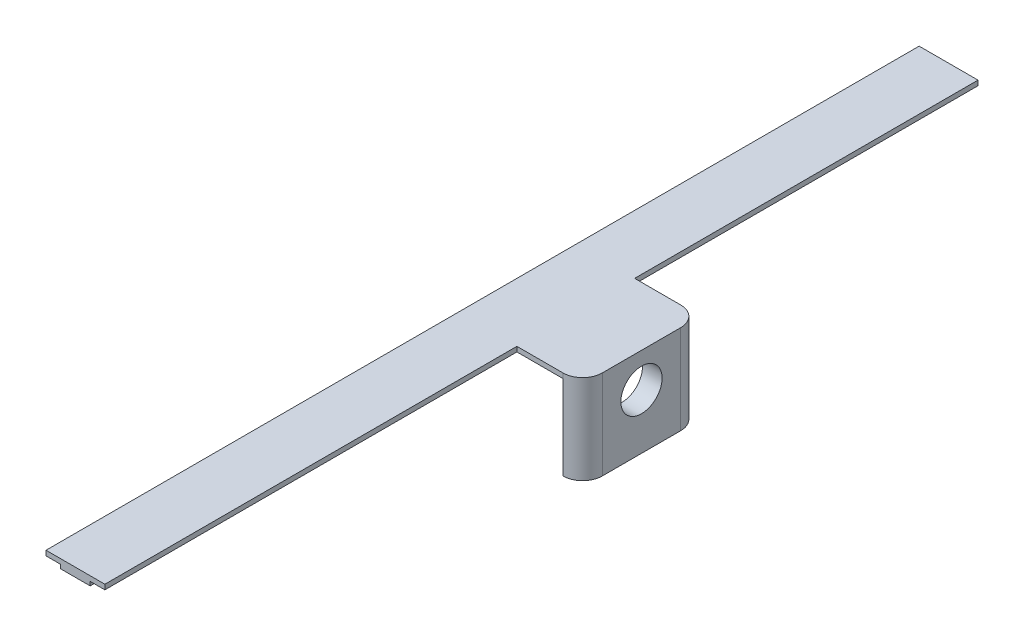
ISO-10303-21;
HEADER;
FILE_DESCRIPTION(('STEP AP214'),'2;1');
FILE_NAME('part.step','',(''),(''),'','','');
FILE_SCHEMA(('AUTOMOTIVE_DESIGN { 1 0 10303 214 1 1 1 1 }'));
ENDSEC;
DATA;
#1=APPLICATION_CONTEXT('core data for automotive mechanical design processes');
#2=APPLICATION_PROTOCOL_DEFINITION('international standard','automotive_design',2000,#1);
#3=PRODUCT_CONTEXT('',#1,'mechanical');
#4=PRODUCT('Part','Part','',(#3));
#5=PRODUCT_RELATED_PRODUCT_CATEGORY('part','',(#4));
#6=PRODUCT_DEFINITION_FORMATION('','',#4);
#7=PRODUCT_DEFINITION_CONTEXT('part definition',#1,'design');
#8=PRODUCT_DEFINITION('design','',#6,#7);
#9=PRODUCT_DEFINITION_SHAPE('','',#8);
#10=(LENGTH_UNIT() NAMED_UNIT(*) SI_UNIT(.MILLI.,.METRE.));
#11=(NAMED_UNIT(*) PLANE_ANGLE_UNIT() SI_UNIT($,.RADIAN.));
#12=(NAMED_UNIT(*) SI_UNIT($,.STERADIAN.) SOLID_ANGLE_UNIT());
#13=UNCERTAINTY_MEASURE_WITH_UNIT(LENGTH_MEASURE(1.E-05),#10,'distance_accuracy_value','');
#14=(GEOMETRIC_REPRESENTATION_CONTEXT(3) GLOBAL_UNCERTAINTY_ASSIGNED_CONTEXT((#13)) GLOBAL_UNIT_ASSIGNED_CONTEXT((#10,
#11,#12)) REPRESENTATION_CONTEXT('',''));
#15=CARTESIAN_POINT('',(0.,0.,0.));
#16=DIRECTION('',(0.,0.,1.));
#17=DIRECTION('',(1.,0.,0.));
#18=AXIS2_PLACEMENT_3D('',#15,#16,#17);
#19=CARTESIAN_POINT('',(0.,0.4,0.));
#20=DIRECTION('',(0.,1.,0.));
#21=DIRECTION('',(0.,0.,1.));
#22=AXIS2_PLACEMENT_3D('',#19,#20,#21);
#23=PLANE('',#22);
#24=DIRECTION('',(0.,0.,-1.));
#25=VECTOR('',#24,1.);
#26=CARTESIAN_POINT('',(7.70000000000001,0.4,2.50000000000001));
#27=LINE('',#26,#25);
#28=CARTESIAN_POINT('',(7.70000000000001,0.4,2.50000000000001));
#29=VERTEX_POINT('',#28);
#30=CARTESIAN_POINT('',(7.70000000000001,0.4,-9.49999999999999));
#31=VERTEX_POINT('',#30);
#32=EDGE_CURVE('E326',#29,#31,#27,.T.);
#33=ORIENTED_EDGE('',*,*,#32,.F.);
#34=DIRECTION('',(1.,0.,0.));
#35=VECTOR('',#34,1.);
#36=CARTESIAN_POINT('',(3.,0.4,2.50000000000001));
#37=LINE('',#36,#35);
#38=CARTESIAN_POINT('',(3.,0.4,2.50000000000001));
#39=VERTEX_POINT('',#38);
#40=EDGE_CURVE('E234',#39,#29,#37,.T.);
#41=ORIENTED_EDGE('',*,*,#40,.F.);
#42=DIRECTION('',(0.,0.,-1.));
#43=VECTOR('',#42,1.);
#44=CARTESIAN_POINT('',(3.,0.4,44.5));
#45=LINE('',#44,#43);
#46=CARTESIAN_POINT('',(3.,0.4,44.5));
#47=VERTEX_POINT('',#46);
#48=EDGE_CURVE('E228',#47,#39,#45,.T.);
#49=ORIENTED_EDGE('',*,*,#48,.F.);
#50=DIRECTION('',(1.,0.,0.));
#51=VECTOR('',#50,1.);
#52=CARTESIAN_POINT('',(-3.,0.4,44.5));
#53=LINE('',#52,#51);
#54=CARTESIAN_POINT('',(1.50000000000001,0.4,44.5));
#55=VERTEX_POINT('',#54);
#56=EDGE_CURVE('E223',#55,#47,#53,.T.);
#57=ORIENTED_EDGE('',*,*,#56,.F.);
#58=DIRECTION('',(0.,0.,-1.));
#59=VECTOR('',#58,1.);
#60=CARTESIAN_POINT('',(1.5,0.4,-44.5));
#61=LINE('',#60,#59);
#62=CARTESIAN_POINT('',(1.5,0.4,-44.5));
#63=VERTEX_POINT('',#62);
#64=EDGE_CURVE('E264',#55,#63,#61,.T.);
#65=ORIENTED_EDGE('',*,*,#64,.T.);
#66=DIRECTION('',(-1.,0.,0.));
#67=VECTOR('',#66,1.);
#68=CARTESIAN_POINT('',(-3.,0.4,-44.5));
#69=LINE('',#68,#67);
#70=CARTESIAN_POINT('',(3.,0.4,-44.5));
#71=VERTEX_POINT('',#70);
#72=EDGE_CURVE('E189',#71,#63,#69,.T.);
#73=ORIENTED_EDGE('',*,*,#72,.F.);
#74=DIRECTION('',(0.,0.,-1.));
#75=VECTOR('',#74,1.);
#76=CARTESIAN_POINT('',(3.,0.4,-9.49999999999999));
#77=LINE('',#76,#75);
#78=CARTESIAN_POINT('',(3.,0.4,-9.49999999999999));
#79=VERTEX_POINT('',#78);
#80=EDGE_CURVE('E196',#79,#71,#77,.T.);
#81=ORIENTED_EDGE('',*,*,#80,.F.);
#82=DIRECTION('',(-1.,0.,0.));
#83=VECTOR('',#82,1.);
#84=CARTESIAN_POINT('',(3.,0.4,-9.49999999999999));
#85=LINE('',#84,#83);
#86=EDGE_CURVE('E237',#31,#79,#85,.T.);
#87=ORIENTED_EDGE('',*,*,#86,.F.);
#88=EDGE_LOOP('',(#33,#41,#49,#57,#65,#73,#81,#87));
#89=FACE_BOUND('',#88,.T.);
#90=ADVANCED_FACE('F44',(#89),#23,.F.);
#91=CARTESIAN_POINT('',(1.5,0.4,-44.5));
#92=DIRECTION('',(-1.,0.,0.));
#93=DIRECTION('',(0.,0.,1.));
#94=AXIS2_PLACEMENT_3D('',#91,#92,#93);
#95=PLANE('',#94);
#96=DIRECTION('',(0.,0.,-1.));
#97=VECTOR('',#96,1.);
#98=CARTESIAN_POINT('',(1.5,0.,-44.5));
#99=LINE('',#98,#97);
#100=CARTESIAN_POINT('',(1.50000000000001,0.,44.5));
#101=VERTEX_POINT('',#100);
#102=CARTESIAN_POINT('',(1.5,0.,-44.5));
#103=VERTEX_POINT('',#102);
#104=EDGE_CURVE('E262',#101,#103,#99,.T.);
#105=ORIENTED_EDGE('',*,*,#104,.T.);
#106=DIRECTION('',(0.,-1.,0.));
#107=VECTOR('',#106,1.);
#108=CARTESIAN_POINT('',(1.5,0.4,-44.5));
#109=LINE('',#108,#107);
#110=EDGE_CURVE('E297',#63,#103,#109,.T.);
#111=ORIENTED_EDGE('',*,*,#110,.F.);
#112=ORIENTED_EDGE('',*,*,#64,.F.);
#113=DIRECTION('',(0.,-1.,0.));
#114=VECTOR('',#113,1.);
#115=CARTESIAN_POINT('',(1.50000000000001,0.4,44.5));
#116=LINE('',#115,#114);
#117=EDGE_CURVE('E273',#55,#101,#116,.T.);
#118=ORIENTED_EDGE('',*,*,#117,.T.);
#119=EDGE_LOOP('',(#105,#111,#112,#118));
#120=FACE_BOUND('',#119,.T.);
#121=ADVANCED_FACE('F355',(#120),#95,.F.);
#122=CARTESIAN_POINT('',(-1.5,0.4,-44.5));
#123=DIRECTION('',(0.,0.,1.));
#124=DIRECTION('',(1.,0.,0.));
#125=AXIS2_PLACEMENT_3D('',#122,#123,#124);
#126=PLANE('',#125);
#127=DIRECTION('',(-1.,0.,0.));
#128=VECTOR('',#127,1.);
#129=CARTESIAN_POINT('',(-1.5,0.,-44.5));
#130=LINE('',#129,#128);
#131=CARTESIAN_POINT('',(-1.5,0.,-44.5));
#132=VERTEX_POINT('',#131);
#133=EDGE_CURVE('E279',#103,#132,#130,.T.);
#134=ORIENTED_EDGE('',*,*,#133,.T.);
#135=DIRECTION('',(0.,-1.,0.));
#136=VECTOR('',#135,1.);
#137=CARTESIAN_POINT('',(-1.5,0.4,-44.5));
#138=LINE('',#137,#136);
#139=CARTESIAN_POINT('',(-1.5,0.4,-44.5));
#140=VERTEX_POINT('',#139);
#141=EDGE_CURVE('E295',#140,#132,#138,.T.);
#142=ORIENTED_EDGE('',*,*,#141,.F.);
#143=CARTESIAN_POINT('',(-3.,0.4,-44.5));
#144=VERTEX_POINT('',#143);
#145=EDGE_CURVE('E185',#140,#144,#69,.T.);
#146=ORIENTED_EDGE('',*,*,#145,.T.);
#147=DIRECTION('',(0.,-1.,0.));
#148=VECTOR('',#147,1.);
#149=CARTESIAN_POINT('',(-3.,0.9,-44.5));
#150=LINE('',#149,#148);
#151=CARTESIAN_POINT('',(-3.,0.9,-44.5));
#152=VERTEX_POINT('',#151);
#153=EDGE_CURVE('E257',#152,#144,#150,.T.);
#154=ORIENTED_EDGE('',*,*,#153,.F.);
#155=DIRECTION('',(-1.,0.,0.));
#156=VECTOR('',#155,1.);
#157=CARTESIAN_POINT('',(-3.,0.9,-44.5));
#158=LINE('',#157,#156);
#159=CARTESIAN_POINT('',(3.,0.9,-44.5));
#160=VERTEX_POINT('',#159);
#161=EDGE_CURVE('E192',#160,#152,#158,.T.);
#162=ORIENTED_EDGE('',*,*,#161,.F.);
#163=DIRECTION('',(0.,-1.,0.));
#164=VECTOR('',#163,1.);
#165=CARTESIAN_POINT('',(3.,0.9,-44.5));
#166=LINE('',#165,#164);
#167=EDGE_CURVE('E217',#160,#71,#166,.T.);
#168=ORIENTED_EDGE('',*,*,#167,.T.);
#169=ORIENTED_EDGE('',*,*,#72,.T.);
#170=ORIENTED_EDGE('',*,*,#110,.T.);
#171=EDGE_LOOP('',(#134,#142,#146,#154,#162,#168,#169,#170));
#172=FACE_BOUND('',#171,.T.);
#173=ADVANCED_FACE('F357',(#172),#126,.F.);
#174=CARTESIAN_POINT('',(-1.5,0.4,-44.5));
#175=DIRECTION('',(1.,0.,0.));
#176=DIRECTION('',(0.,0.,-1.));
#177=AXIS2_PLACEMENT_3D('',#174,#175,#176);
#178=PLANE('',#177);
#179=DIRECTION('',(0.,0.,1.));
#180=VECTOR('',#179,1.);
#181=CARTESIAN_POINT('',(-1.5,0.,-44.5));
#182=LINE('',#181,#180);
#183=CARTESIAN_POINT('',(-1.49999999999999,0.,44.5));
#184=VERTEX_POINT('',#183);
#185=EDGE_CURVE('E282',#132,#184,#182,.T.);
#186=ORIENTED_EDGE('',*,*,#185,.T.);
#187=DIRECTION('',(0.,-1.,0.));
#188=VECTOR('',#187,1.);
#189=CARTESIAN_POINT('',(-1.49999999999999,0.4,44.5));
#190=LINE('',#189,#188);
#191=CARTESIAN_POINT('',(-1.5,0.4,44.5));
#192=VERTEX_POINT('',#191);
#193=EDGE_CURVE('E289',#192,#184,#190,.T.);
#194=ORIENTED_EDGE('',*,*,#193,.F.);
#195=DIRECTION('',(0.,0.,1.));
#196=VECTOR('',#195,1.);
#197=CARTESIAN_POINT('',(-1.5,0.4,-44.5));
#198=LINE('',#197,#196);
#199=EDGE_CURVE('E267',#140,#192,#198,.T.);
#200=ORIENTED_EDGE('',*,*,#199,.F.);
#201=ORIENTED_EDGE('',*,*,#141,.T.);
#202=EDGE_LOOP('',(#186,#194,#200,#201));
#203=FACE_BOUND('',#202,.T.);
#204=ADVANCED_FACE('F383',(#203),#178,.F.);
#205=CARTESIAN_POINT('',(-1.49999999999999,0.4,44.5));
#206=DIRECTION('',(0.,0.,-1.));
#207=DIRECTION('',(-1.,0.,0.));
#208=AXIS2_PLACEMENT_3D('',#205,#206,#207);
#209=PLANE('',#208);
#210=DIRECTION('',(1.,0.,0.));
#211=VECTOR('',#210,1.);
#212=CARTESIAN_POINT('',(-1.49999999999999,0.,44.5));
#213=LINE('',#212,#211);
#214=EDGE_CURVE('E269',#184,#101,#213,.T.);
#215=ORIENTED_EDGE('',*,*,#214,.T.);
#216=ORIENTED_EDGE('',*,*,#117,.F.);
#217=ORIENTED_EDGE('',*,*,#56,.T.);
#218=DIRECTION('',(0.,-1.,0.));
#219=VECTOR('',#218,1.);
#220=CARTESIAN_POINT('',(3.,0.9,44.5));
#221=LINE('',#220,#219);
#222=CARTESIAN_POINT('',(3.,0.9,44.5));
#223=VERTEX_POINT('',#222);
#224=EDGE_CURVE('E252',#223,#47,#221,.T.);
#225=ORIENTED_EDGE('',*,*,#224,.F.);
#226=DIRECTION('',(1.,0.,0.));
#227=VECTOR('',#226,1.);
#228=CARTESIAN_POINT('',(-3.,0.9,44.5));
#229=LINE('',#228,#227);
#230=CARTESIAN_POINT('',(-3.,0.9,44.5));
#231=VERTEX_POINT('',#230);
#232=EDGE_CURVE('E203',#231,#223,#229,.T.);
#233=ORIENTED_EDGE('',*,*,#232,.F.);
#234=DIRECTION('',(0.,-1.,0.));
#235=VECTOR('',#234,1.);
#236=CARTESIAN_POINT('',(-3.,0.9,44.5));
#237=LINE('',#236,#235);
#238=CARTESIAN_POINT('',(-3.,0.4,44.5));
#239=VERTEX_POINT('',#238);
#240=EDGE_CURVE('E258',#231,#239,#237,.T.);
#241=ORIENTED_EDGE('',*,*,#240,.T.);
#242=EDGE_CURVE('E227',#239,#192,#53,.T.);
#243=ORIENTED_EDGE('',*,*,#242,.T.);
#244=ORIENTED_EDGE('',*,*,#193,.T.);
#245=EDGE_LOOP('',(#215,#216,#217,#225,#233,#241,#243,#244));
#246=FACE_BOUND('',#245,.T.);
#247=ADVANCED_FACE('F375',(#246),#209,.F.);
#248=CARTESIAN_POINT('',(0.,0.,0.));
#249=DIRECTION('',(0.,1.,0.));
#250=DIRECTION('',(0.,0.,1.));
#251=AXIS2_PLACEMENT_3D('',#248,#249,#250);
#252=PLANE('',#251);
#253=ORIENTED_EDGE('',*,*,#104,.F.);
#254=ORIENTED_EDGE('',*,*,#214,.F.);
#255=ORIENTED_EDGE('',*,*,#185,.F.);
#256=ORIENTED_EDGE('',*,*,#133,.F.);
#257=EDGE_LOOP('',(#253,#254,#255,#256));
#258=FACE_BOUND('',#257,.T.);
#259=ADVANCED_FACE('F364',(#258),#252,.F.);
#260=ORIENTED_EDGE('',*,*,#145,.F.);
#261=ORIENTED_EDGE('',*,*,#199,.T.);
#262=ORIENTED_EDGE('',*,*,#242,.F.);
#263=DIRECTION('',(0.,0.,1.));
#264=VECTOR('',#263,1.);
#265=CARTESIAN_POINT('',(-3.,0.4,44.5));
#266=LINE('',#265,#264);
#267=EDGE_CURVE('E225',#144,#239,#266,.T.);
#268=ORIENTED_EDGE('',*,*,#267,.F.);
#269=EDGE_LOOP('',(#260,#261,#262,#268));
#270=FACE_BOUND('',#269,.T.);
#271=ADVANCED_FACE('F353',(#270),#23,.F.);
#272=CARTESIAN_POINT('',(-3.,0.9,44.5));
#273=DIRECTION('',(1.,0.,0.));
#274=DIRECTION('',(0.,0.,-1.));
#275=AXIS2_PLACEMENT_3D('',#272,#273,#274);
#276=PLANE('',#275);
#277=ORIENTED_EDGE('',*,*,#267,.T.);
#278=ORIENTED_EDGE('',*,*,#240,.F.);
#279=DIRECTION('',(0.,0.,1.));
#280=VECTOR('',#279,1.);
#281=CARTESIAN_POINT('',(-3.,0.9,44.5));
#282=LINE('',#281,#280);
#283=EDGE_CURVE('E197',#152,#231,#282,.T.);
#284=ORIENTED_EDGE('',*,*,#283,.F.);
#285=ORIENTED_EDGE('',*,*,#153,.T.);
#286=EDGE_LOOP('',(#277,#278,#284,#285));
#287=FACE_BOUND('',#286,.T.);
#288=ADVANCED_FACE('F365',(#287),#276,.F.);
#289=CARTESIAN_POINT('',(3.,0.9,44.5));
#290=DIRECTION('',(-1.,0.,0.));
#291=DIRECTION('',(0.,0.,1.));
#292=AXIS2_PLACEMENT_3D('',#289,#290,#291);
#293=PLANE('',#292);
#294=ORIENTED_EDGE('',*,*,#48,.T.);
#295=DIRECTION('',(0.,-1.,0.));
#296=VECTOR('',#295,1.);
#297=CARTESIAN_POINT('',(3.,0.9,2.50000000000001));
#298=LINE('',#297,#296);
#299=CARTESIAN_POINT('',(3.,0.9,2.50000000000001));
#300=VERTEX_POINT('',#299);
#301=EDGE_CURVE('E247',#300,#39,#298,.T.);
#302=ORIENTED_EDGE('',*,*,#301,.F.);
#303=DIRECTION('',(0.,0.,-1.));
#304=VECTOR('',#303,1.);
#305=CARTESIAN_POINT('',(3.,0.9,44.5));
#306=LINE('',#305,#304);
#307=EDGE_CURVE('E204',#223,#300,#306,.T.);
#308=ORIENTED_EDGE('',*,*,#307,.F.);
#309=ORIENTED_EDGE('',*,*,#224,.T.);
#310=EDGE_LOOP('',(#294,#302,#308,#309));
#311=FACE_BOUND('',#310,.T.);
#312=ADVANCED_FACE('F348',(#311),#293,.F.);
#313=CARTESIAN_POINT('',(3.,0.9,2.50000000000001));
#314=DIRECTION('',(0.,0.,-1.));
#315=DIRECTION('',(-1.,0.,0.));
#316=AXIS2_PLACEMENT_3D('',#313,#314,#315);
#317=PLANE('',#316);
#318=ORIENTED_EDGE('',*,*,#40,.T.);
#319=DIRECTION('',(0.,-1.,0.));
#320=VECTOR('',#319,1.);
#321=CARTESIAN_POINT('',(7.70000000000001,0.9,2.50000000000001));
#322=LINE('',#321,#320);
#323=CARTESIAN_POINT('',(7.70000000000001,0.9,2.50000000000001));
#324=VERTEX_POINT('',#323);
#325=EDGE_CURVE('E70',#29,#324,#322,.F.);
#326=ORIENTED_EDGE('',*,*,#325,.T.);
#327=DIRECTION('',(1.,0.,0.));
#328=VECTOR('',#327,1.);
#329=CARTESIAN_POINT('',(3.,0.9,2.50000000000001));
#330=LINE('',#329,#328);
#331=EDGE_CURVE('E210',#300,#324,#330,.T.);
#332=ORIENTED_EDGE('',*,*,#331,.F.);
#333=ORIENTED_EDGE('',*,*,#301,.T.);
#334=EDGE_LOOP('',(#318,#326,#332,#333));
#335=FACE_BOUND('',#334,.T.);
#336=ADVANCED_FACE('F344',(#335),#317,.F.);
#337=CARTESIAN_POINT('',(9.7,0.9,-9.49999999999999));
#338=DIRECTION('',(-1.,0.,0.));
#339=DIRECTION('',(0.,0.,1.));
#340=AXIS2_PLACEMENT_3D('',#337,#338,#339);
#341=PLANE('',#340);
#342=CARTESIAN_POINT('',(9.70000000000001,-2.6,-3.49999999999999));
#343=DIRECTION('',(1.,0.,0.));
#344=DIRECTION('',(0.,0.,-1.));
#345=AXIS2_PLACEMENT_3D('',#342,#343,#344);
#346=CIRCLE('',#345,2.1);
#347=CARTESIAN_POINT('',(9.70000000000001,-2.6,-5.59999999999999));
#348=VERTEX_POINT('',#347);
#349=EDGE_CURVE('E334',#348,#348,#346,.T.);
#350=ORIENTED_EDGE('',*,*,#349,.F.);
#351=EDGE_LOOP('',(#350));
#352=FACE_BOUND('',#351,.T.);
#353=DIRECTION('',(0.,0.,-1.));
#354=VECTOR('',#353,1.);
#355=CARTESIAN_POINT('',(9.7,0.9,-9.49999999999999));
#356=LINE('',#355,#354);
#357=CARTESIAN_POINT('',(9.70000000000001,0.9,0.500000000000013));
#358=VERTEX_POINT('',#357);
#359=CARTESIAN_POINT('',(9.7,0.9,-7.49999999999999));
#360=VERTEX_POINT('',#359);
#361=EDGE_CURVE('E209',#358,#360,#356,.T.);
#362=ORIENTED_EDGE('',*,*,#361,.F.);
#363=DIRECTION('',(0.,-1.,0.));
#364=VECTOR('',#363,1.);
#365=CARTESIAN_POINT('',(9.70000000000001,0.9,0.500000000000013));
#366=LINE('',#365,#364);
#367=CARTESIAN_POINT('',(9.70000000000001,-8.2,0.500000000000012));
#368=VERTEX_POINT('',#367);
#369=EDGE_CURVE('E302',#358,#368,#366,.T.);
#370=ORIENTED_EDGE('',*,*,#369,.T.);
#371=DIRECTION('',(0.,0.,1.));
#372=VECTOR('',#371,1.);
#373=CARTESIAN_POINT('',(9.70000000000001,-8.2,2.50000000000001));
#374=LINE('',#373,#372);
#375=CARTESIAN_POINT('',(9.70000000000001,-8.2,-7.49999999999999));
#376=VERTEX_POINT('',#375);
#377=EDGE_CURVE('E165',#376,#368,#374,.T.);
#378=ORIENTED_EDGE('',*,*,#377,.F.);
#379=DIRECTION('',(0.,-1.,0.));
#380=VECTOR('',#379,1.);
#381=CARTESIAN_POINT('',(9.7,0.9,-7.49999999999999));
#382=LINE('',#381,#380);
#383=EDGE_CURVE('E298',#376,#360,#382,.F.);
#384=ORIENTED_EDGE('',*,*,#383,.T.);
#385=EDGE_LOOP('',(#362,#370,#378,#384));
#386=FACE_BOUND('',#385,.T.);
#387=ADVANCED_FACE('F312',(#352,#386),#341,.F.);
#388=CARTESIAN_POINT('',(3.,0.9,-9.49999999999999));
#389=DIRECTION('',(0.,0.,1.));
#390=DIRECTION('',(1.,0.,0.));
#391=AXIS2_PLACEMENT_3D('',#388,#389,#390);
#392=PLANE('',#391);
#393=DIRECTION('',(-1.,0.,0.));
#394=VECTOR('',#393,1.);
#395=CARTESIAN_POINT('',(3.,0.9,-9.49999999999999));
#396=LINE('',#395,#394);
#397=CARTESIAN_POINT('',(7.70000000000001,0.9,-9.49999999999999));
#398=VERTEX_POINT('',#397);
#399=CARTESIAN_POINT('',(3.,0.9,-9.49999999999999));
#400=VERTEX_POINT('',#399);
#401=EDGE_CURVE('E213',#398,#400,#396,.T.);
#402=ORIENTED_EDGE('',*,*,#401,.F.);
#403=DIRECTION('',(0.,-1.,0.));
#404=VECTOR('',#403,1.);
#405=CARTESIAN_POINT('',(7.70000000000001,0.9,-9.49999999999999));
#406=LINE('',#405,#404);
#407=EDGE_CURVE('E11',#398,#31,#406,.T.);
#408=ORIENTED_EDGE('',*,*,#407,.T.);
#409=ORIENTED_EDGE('',*,*,#86,.T.);
#410=DIRECTION('',(0.,-1.,0.));
#411=VECTOR('',#410,1.);
#412=CARTESIAN_POINT('',(3.,0.9,-9.49999999999999));
#413=LINE('',#412,#411);
#414=EDGE_CURVE('E241',#400,#79,#413,.T.);
#415=ORIENTED_EDGE('',*,*,#414,.F.);
#416=EDGE_LOOP('',(#402,#408,#409,#415));
#417=FACE_BOUND('',#416,.T.);
#418=ADVANCED_FACE('F321',(#417),#392,.F.);
#419=CARTESIAN_POINT('',(3.,0.9,-9.49999999999999));
#420=DIRECTION('',(-1.,0.,0.));
#421=DIRECTION('',(0.,0.,1.));
#422=AXIS2_PLACEMENT_3D('',#419,#420,#421);
#423=PLANE('',#422);
#424=ORIENTED_EDGE('',*,*,#80,.T.);
#425=ORIENTED_EDGE('',*,*,#167,.F.);
#426=DIRECTION('',(0.,0.,-1.));
#427=VECTOR('',#426,1.);
#428=CARTESIAN_POINT('',(3.,0.9,-9.49999999999999));
#429=LINE('',#428,#427);
#430=EDGE_CURVE('E216',#400,#160,#429,.T.);
#431=ORIENTED_EDGE('',*,*,#430,.F.);
#432=ORIENTED_EDGE('',*,*,#414,.T.);
#433=EDGE_LOOP('',(#424,#425,#431,#432));
#434=FACE_BOUND('',#433,.T.);
#435=ADVANCED_FACE('F346',(#434),#423,.F.);
#436=CARTESIAN_POINT('',(0.,0.9,0.));
#437=DIRECTION('',(0.,1.,0.));
#438=DIRECTION('',(0.,0.,1.));
#439=AXIS2_PLACEMENT_3D('',#436,#437,#438);
#440=PLANE('',#439);
#441=ORIENTED_EDGE('',*,*,#331,.T.);
#442=CARTESIAN_POINT('',(7.70000000000001,0.9,0.500000000000013));
#443=DIRECTION('',(0.,1.,0.));
#444=DIRECTION('',(0.,0.,1.));
#445=AXIS2_PLACEMENT_3D('',#442,#443,#444);
#446=CIRCLE('',#445,2.);
#447=EDGE_CURVE('E54',#324,#358,#446,.T.);
#448=ORIENTED_EDGE('',*,*,#447,.T.);
#449=ORIENTED_EDGE('',*,*,#361,.T.);
#450=CARTESIAN_POINT('',(7.70000000000001,0.9,-7.49999999999999));
#451=DIRECTION('',(0.,1.,0.));
#452=DIRECTION('',(0.,0.,1.));
#453=AXIS2_PLACEMENT_3D('',#450,#451,#452);
#454=CIRCLE('',#453,2.);
#455=EDGE_CURVE('E64',#360,#398,#454,.T.);
#456=ORIENTED_EDGE('',*,*,#455,.T.);
#457=ORIENTED_EDGE('',*,*,#401,.T.);
#458=ORIENTED_EDGE('',*,*,#430,.T.);
#459=ORIENTED_EDGE('',*,*,#161,.T.);
#460=ORIENTED_EDGE('',*,*,#283,.T.);
#461=ORIENTED_EDGE('',*,*,#232,.T.);
#462=ORIENTED_EDGE('',*,*,#307,.T.);
#463=EDGE_LOOP('',(#441,#448,#449,#456,#457,#458,#459,#460,#461,#462));
#464=FACE_BOUND('',#463,.T.);
#465=ADVANCED_FACE('F311',(#464),#440,.T.);
#466=CARTESIAN_POINT('',(7.70000000000001,-8.2,2.50000000000001));
#467=DIRECTION('',(1.,0.,0.));
#468=DIRECTION('',(0.,0.,-1.));
#469=AXIS2_PLACEMENT_3D('',#466,#467,#468);
#470=PLANE('',#469);
#471=CARTESIAN_POINT('',(7.70000000000001,-2.6,-3.49999999999999));
#472=DIRECTION('',(1.,0.,0.));
#473=DIRECTION('',(0.,0.,-1.));
#474=AXIS2_PLACEMENT_3D('',#471,#472,#473);
#475=CIRCLE('',#474,2.1);
#476=CARTESIAN_POINT('',(7.70000000000001,-2.6,-5.59999999999999));
#477=VERTEX_POINT('',#476);
#478=EDGE_CURVE('E47',#477,#477,#475,.T.);
#479=ORIENTED_EDGE('',*,*,#478,.T.);
#480=EDGE_LOOP('',(#479));
#481=FACE_BOUND('',#480,.T.);
#482=ORIENTED_EDGE('',*,*,#32,.T.);
#483=DIRECTION('',(0.,1.,0.));
#484=VECTOR('',#483,1.);
#485=CARTESIAN_POINT('',(7.70000000000001,-8.2,-9.49999999999999));
#486=LINE('',#485,#484);
#487=CARTESIAN_POINT('',(7.70000000000001,-8.2,-9.49999999999999));
#488=VERTEX_POINT('',#487);
#489=EDGE_CURVE('E173',#488,#31,#486,.T.);
#490=ORIENTED_EDGE('',*,*,#489,.F.);
#491=DIRECTION('',(0.,0.,-1.));
#492=VECTOR('',#491,1.);
#493=CARTESIAN_POINT('',(7.70000000000001,-8.2,2.50000000000001));
#494=LINE('',#493,#492);
#495=CARTESIAN_POINT('',(7.70000000000001,-8.2,2.50000000000001));
#496=VERTEX_POINT('',#495);
#497=EDGE_CURVE('E157',#496,#488,#494,.T.);
#498=ORIENTED_EDGE('',*,*,#497,.F.);
#499=DIRECTION('',(0.,1.,0.));
#500=VECTOR('',#499,1.);
#501=CARTESIAN_POINT('',(7.70000000000001,-8.2,2.50000000000001));
#502=LINE('',#501,#500);
#503=EDGE_CURVE('E171',#496,#29,#502,.T.);
#504=ORIENTED_EDGE('',*,*,#503,.T.);
#505=EDGE_LOOP('',(#482,#490,#498,#504));
#506=FACE_BOUND('',#505,.T.);
#507=ADVANCED_FACE('F175',(#481,#506),#470,.F.);
#508=CARTESIAN_POINT('',(0.,-8.2,0.));
#509=DIRECTION('',(0.,1.,0.));
#510=DIRECTION('',(0.,0.,1.));
#511=AXIS2_PLACEMENT_3D('',#508,#509,#510);
#512=PLANE('',#511);
#513=ORIENTED_EDGE('',*,*,#377,.T.);
#514=CARTESIAN_POINT('',(7.70000000000001,-8.2,0.500000000000013));
#515=DIRECTION('',(0.,1.,0.));
#516=DIRECTION('',(0.,0.,1.));
#517=AXIS2_PLACEMENT_3D('',#514,#515,#516);
#518=CIRCLE('',#517,2.);
#519=EDGE_CURVE('E156',#368,#496,#518,.F.);
#520=ORIENTED_EDGE('',*,*,#519,.T.);
#521=ORIENTED_EDGE('',*,*,#497,.T.);
#522=CARTESIAN_POINT('',(7.70000000000001,-8.2,-7.49999999999999));
#523=DIRECTION('',(0.,1.,0.));
#524=DIRECTION('',(0.,0.,1.));
#525=AXIS2_PLACEMENT_3D('',#522,#523,#524);
#526=CIRCLE('',#525,2.);
#527=EDGE_CURVE('E169',#488,#376,#526,.F.);
#528=ORIENTED_EDGE('',*,*,#527,.T.);
#529=EDGE_LOOP('',(#513,#520,#521,#528));
#530=FACE_BOUND('',#529,.T.);
#531=ADVANCED_FACE('F158',(#530),#512,.F.);
#532=CARTESIAN_POINT('',(7.70000000000001,0.9,0.500000000000013));
#533=DIRECTION('',(0.,-1.,0.));
#534=DIRECTION('',(0.,0.,-1.));
#535=AXIS2_PLACEMENT_3D('',#532,#533,#534);
#536=CYLINDRICAL_SURFACE('',#535,2.);
#537=ORIENTED_EDGE('',*,*,#325,.F.);
#538=ORIENTED_EDGE('',*,*,#503,.F.);
#539=ORIENTED_EDGE('',*,*,#519,.F.);
#540=ORIENTED_EDGE('',*,*,#369,.F.);
#541=ORIENTED_EDGE('',*,*,#447,.F.);
#542=EDGE_LOOP('',(#537,#538,#539,#540,#541));
#543=FACE_BOUND('',#542,.T.);
#544=ADVANCED_FACE('F178',(#543),#536,.T.);
#545=CARTESIAN_POINT('',(7.70000000000001,0.9,-7.49999999999999));
#546=DIRECTION('',(0.,-1.,0.));
#547=DIRECTION('',(0.,0.,-1.));
#548=AXIS2_PLACEMENT_3D('',#545,#546,#547);
#549=CYLINDRICAL_SURFACE('',#548,2.);
#550=ORIENTED_EDGE('',*,*,#455,.F.);
#551=ORIENTED_EDGE('',*,*,#383,.F.);
#552=ORIENTED_EDGE('',*,*,#527,.F.);
#553=ORIENTED_EDGE('',*,*,#489,.T.);
#554=ORIENTED_EDGE('',*,*,#407,.F.);
#555=EDGE_LOOP('',(#550,#551,#552,#553,#554));
#556=FACE_BOUND('',#555,.T.);
#557=ADVANCED_FACE('F50',(#556),#549,.T.);
#558=CARTESIAN_POINT('',(-3.,-2.6,-3.49999999999999));
#559=DIRECTION('',(1.,0.,0.));
#560=DIRECTION('',(0.,0.,-1.));
#561=AXIS2_PLACEMENT_3D('',#558,#559,#560);
#562=CYLINDRICAL_SURFACE('',#561,2.1);
#563=ORIENTED_EDGE('',*,*,#349,.T.);
#564=EDGE_LOOP('',(#563));
#565=FACE_BOUND('',#564,.T.);
#566=ORIENTED_EDGE('',*,*,#478,.F.);
#567=EDGE_LOOP('',(#566));
#568=FACE_BOUND('',#567,.T.);
#569=ADVANCED_FACE('F336',(#565,#568),#562,.F.);
#570=CLOSED_SHELL('',(#90,#121,#173,#204,#247,#259,#271,#288,#312,#336,#387,#418,#435,#465,#507,
#531,#544,#557,#569));
#571=MANIFOLD_SOLID_BREP('B2',#570);
#572=ADVANCED_BREP_SHAPE_REPRESENTATION('',(#18,#571),#14);
#573=SHAPE_DEFINITION_REPRESENTATION(#9,#572);
ENDSEC;
END-ISO-10303-21;
